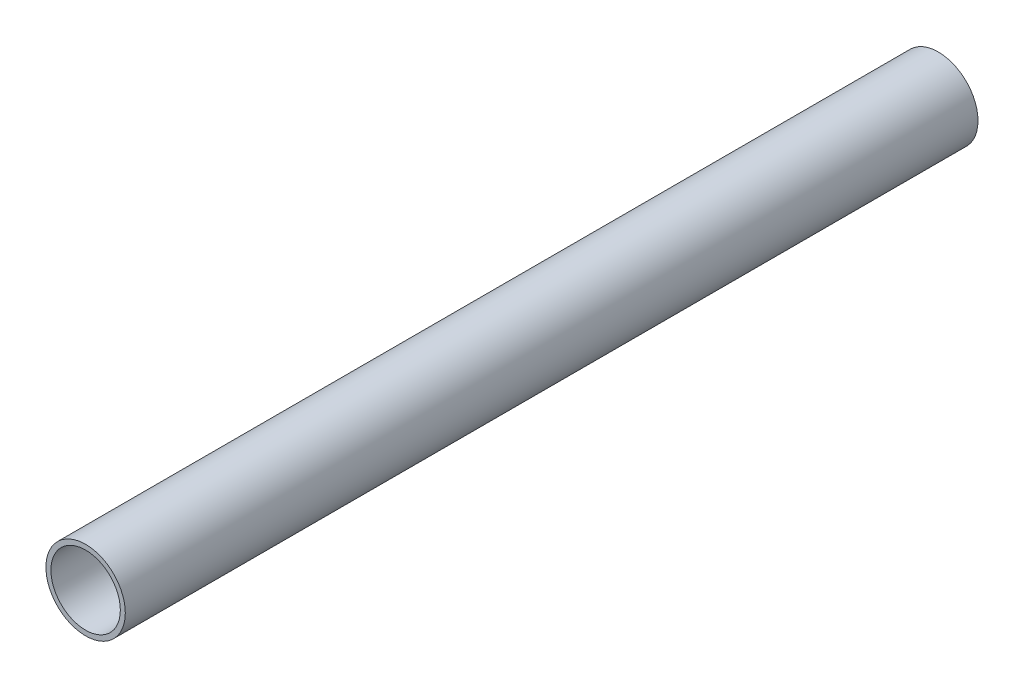
ISO-10303-21;
HEADER;
FILE_DESCRIPTION(('STEP AP214'),'2;1');
FILE_NAME('part.step','',(''),(''),'','','');
FILE_SCHEMA(('AUTOMOTIVE_DESIGN { 1 0 10303 214 1 1 1 1 }'));
ENDSEC;
DATA;
#1=APPLICATION_CONTEXT('core data for automotive mechanical design processes');
#2=APPLICATION_PROTOCOL_DEFINITION('international standard','automotive_design',2000,#1);
#3=PRODUCT_CONTEXT('',#1,'mechanical');
#4=PRODUCT('Part','Part','',(#3));
#5=PRODUCT_RELATED_PRODUCT_CATEGORY('part','',(#4));
#6=PRODUCT_DEFINITION_FORMATION('','',#4);
#7=PRODUCT_DEFINITION_CONTEXT('part definition',#1,'design');
#8=PRODUCT_DEFINITION('design','',#6,#7);
#9=PRODUCT_DEFINITION_SHAPE('','',#8);
#10=(LENGTH_UNIT() NAMED_UNIT(*) SI_UNIT(.MILLI.,.METRE.));
#11=(NAMED_UNIT(*) PLANE_ANGLE_UNIT() SI_UNIT($,.RADIAN.));
#12=(NAMED_UNIT(*) SI_UNIT($,.STERADIAN.) SOLID_ANGLE_UNIT());
#13=UNCERTAINTY_MEASURE_WITH_UNIT(LENGTH_MEASURE(1.E-05),#10,'distance_accuracy_value','');
#14=(GEOMETRIC_REPRESENTATION_CONTEXT(3) GLOBAL_UNCERTAINTY_ASSIGNED_CONTEXT((#13)) GLOBAL_UNIT_ASSIGNED_CONTEXT((#10,
#11,#12)) REPRESENTATION_CONTEXT('',''));
#15=CARTESIAN_POINT('',(0.,0.,0.));
#16=DIRECTION('',(0.,0.,1.));
#17=DIRECTION('',(1.,0.,0.));
#18=AXIS2_PLACEMENT_3D('',#15,#16,#17);
#19=CARTESIAN_POINT('',(0.,0.,272.89));
#20=DIRECTION('',(0.,0.,1.));
#21=DIRECTION('',(1.,0.,0.));
#22=AXIS2_PLACEMENT_3D('',#19,#20,#21);
#23=PLANE('',#22);
#24=CARTESIAN_POINT('',(0.,0.,272.89));
#25=DIRECTION('',(0.,0.,1.));
#26=DIRECTION('',(1.,0.,0.));
#27=AXIS2_PLACEMENT_3D('',#24,#25,#26);
#28=CIRCLE('',#27,12.7);
#29=CARTESIAN_POINT('',(12.7,0.,272.89));
#30=VERTEX_POINT('',#29);
#31=EDGE_CURVE('E10',#30,#30,#28,.T.);
#32=ORIENTED_EDGE('',*,*,#31,.T.);
#33=EDGE_LOOP('',(#32));
#34=FACE_BOUND('',#33,.T.);
#35=CARTESIAN_POINT('',(0.,0.,272.89));
#36=DIRECTION('',(0.,0.,1.));
#37=DIRECTION('',(1.,0.,0.));
#38=AXIS2_PLACEMENT_3D('',#35,#36,#37);
#39=CIRCLE('',#38,11.1125);
#40=CARTESIAN_POINT('',(11.1125,0.,272.89));
#41=VERTEX_POINT('',#40);
#42=EDGE_CURVE('E44',#41,#41,#39,.T.);
#43=ORIENTED_EDGE('',*,*,#42,.F.);
#44=EDGE_LOOP('',(#43));
#45=FACE_BOUND('',#44,.T.);
#46=ADVANCED_FACE('F33',(#34,#45),#23,.T.);
#47=CARTESIAN_POINT('',(0.,0.,0.));
#48=DIRECTION('',(0.,0.,1.));
#49=DIRECTION('',(1.,0.,0.));
#50=AXIS2_PLACEMENT_3D('',#47,#48,#49);
#51=PLANE('',#50);
#52=CARTESIAN_POINT('',(0.,0.,0.));
#53=DIRECTION('',(0.,0.,1.));
#54=DIRECTION('',(1.,0.,0.));
#55=AXIS2_PLACEMENT_3D('',#52,#53,#54);
#56=CIRCLE('',#55,12.7);
#57=CARTESIAN_POINT('',(12.7,0.,0.));
#58=VERTEX_POINT('',#57);
#59=EDGE_CURVE('E37',#58,#58,#56,.T.);
#60=ORIENTED_EDGE('',*,*,#59,.F.);
#61=EDGE_LOOP('',(#60));
#62=FACE_BOUND('',#61,.T.);
#63=CARTESIAN_POINT('',(0.,0.,0.));
#64=DIRECTION('',(0.,0.,1.));
#65=DIRECTION('',(1.,0.,0.));
#66=AXIS2_PLACEMENT_3D('',#63,#64,#65);
#67=CIRCLE('',#66,11.1125);
#68=CARTESIAN_POINT('',(11.1125,0.,0.));
#69=VERTEX_POINT('',#68);
#70=EDGE_CURVE('E46',#69,#69,#67,.T.);
#71=ORIENTED_EDGE('',*,*,#70,.T.);
#72=EDGE_LOOP('',(#71));
#73=FACE_BOUND('',#72,.T.);
#74=ADVANCED_FACE('F56',(#62,#73),#51,.F.);
#75=CARTESIAN_POINT('',(0.,0.,272.89));
#76=DIRECTION('',(0.,0.,-1.));
#77=DIRECTION('',(-1.,0.,0.));
#78=AXIS2_PLACEMENT_3D('',#75,#76,#77);
#79=CYLINDRICAL_SURFACE('',#78,12.7);
#80=ORIENTED_EDGE('',*,*,#31,.F.);
#81=EDGE_LOOP('',(#80));
#82=FACE_BOUND('',#81,.T.);
#83=ORIENTED_EDGE('',*,*,#59,.T.);
#84=EDGE_LOOP('',(#83));
#85=FACE_BOUND('',#84,.T.);
#86=ADVANCED_FACE('F35',(#82,#85),#79,.T.);
#87=CARTESIAN_POINT('',(0.,0.,272.89));
#88=DIRECTION('',(0.,0.,-1.));
#89=DIRECTION('',(-1.,0.,0.));
#90=AXIS2_PLACEMENT_3D('',#87,#88,#89);
#91=CYLINDRICAL_SURFACE('',#90,11.1125);
#92=ORIENTED_EDGE('',*,*,#42,.T.);
#93=EDGE_LOOP('',(#92));
#94=FACE_BOUND('',#93,.T.);
#95=ORIENTED_EDGE('',*,*,#70,.F.);
#96=EDGE_LOOP('',(#95));
#97=FACE_BOUND('',#96,.T.);
#98=ADVANCED_FACE('F52',(#94,#97),#91,.F.);
#99=CLOSED_SHELL('',(#46,#74,#86,#98));
#100=MANIFOLD_SOLID_BREP('B2',#99);
#101=ADVANCED_BREP_SHAPE_REPRESENTATION('',(#18,#100),#14);
#102=SHAPE_DEFINITION_REPRESENTATION(#9,#101);
ENDSEC;
END-ISO-10303-21;
